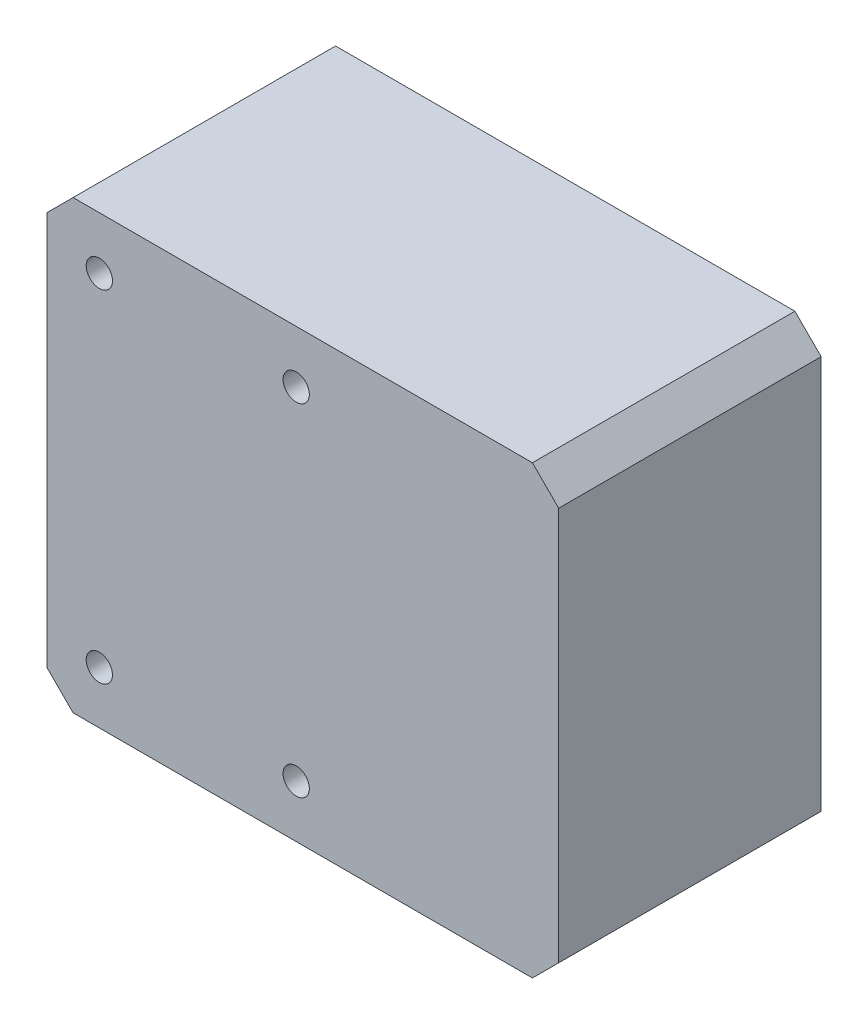
ISO-10303-21;
HEADER;
FILE_DESCRIPTION(('STEP AP214'),'2;1');
FILE_NAME('part.step','',(''),(''),'','','');
FILE_SCHEMA(('AUTOMOTIVE_DESIGN { 1 0 10303 214 1 1 1 1 }'));
ENDSEC;
DATA;
#1=APPLICATION_CONTEXT('core data for automotive mechanical design processes');
#2=APPLICATION_PROTOCOL_DEFINITION('international standard','automotive_design',2000,#1);
#3=PRODUCT_CONTEXT('',#1,'mechanical');
#4=PRODUCT('Part','Part','',(#3));
#5=PRODUCT_RELATED_PRODUCT_CATEGORY('part','',(#4));
#6=PRODUCT_DEFINITION_FORMATION('','',#4);
#7=PRODUCT_DEFINITION_CONTEXT('part definition',#1,'design');
#8=PRODUCT_DEFINITION('design','',#6,#7);
#9=PRODUCT_DEFINITION_SHAPE('','',#8);
#10=(LENGTH_UNIT() NAMED_UNIT(*) SI_UNIT(.MILLI.,.METRE.));
#11=(NAMED_UNIT(*) PLANE_ANGLE_UNIT() SI_UNIT($,.RADIAN.));
#12=(NAMED_UNIT(*) SI_UNIT($,.STERADIAN.) SOLID_ANGLE_UNIT());
#13=UNCERTAINTY_MEASURE_WITH_UNIT(LENGTH_MEASURE(1.E-05),#10,'distance_accuracy_value','');
#14=(GEOMETRIC_REPRESENTATION_CONTEXT(3) GLOBAL_UNCERTAINTY_ASSIGNED_CONTEXT((#13)) GLOBAL_UNIT_ASSIGNED_CONTEXT((#10,
#11,#12)) REPRESENTATION_CONTEXT('',''));
#15=CARTESIAN_POINT('',(0.,0.,0.));
#16=DIRECTION('',(0.,0.,1.));
#17=DIRECTION('',(1.,0.,0.));
#18=AXIS2_PLACEMENT_3D('',#15,#16,#17);
#19=CARTESIAN_POINT('',(0.,0.,100.));
#20=DIRECTION('',(0.,0.,-1.));
#21=DIRECTION('',(-1.,0.,0.));
#22=AXIS2_PLACEMENT_3D('',#19,#20,#21);
#23=PLANE('',#22);
#24=DIRECTION('',(-1.,0.,0.));
#25=VECTOR('',#24,1.);
#26=CARTESIAN_POINT('',(-57.5,85.,100.));
#27=LINE('',#26,#25);
#28=CARTESIAN_POINT('',(127.5,85.,100.));
#29=VERTEX_POINT('',#28);
#30=CARTESIAN_POINT('',(-47.5,85.,100.));
#31=VERTEX_POINT('',#30);
#32=EDGE_CURVE('E169',#29,#31,#27,.T.);
#33=ORIENTED_EDGE('',*,*,#32,.T.);
#34=DIRECTION('',(0.70710678118655,0.707106781186545,0.));
#35=VECTOR('',#34,1.);
#36=CARTESIAN_POINT('',(-57.5,75.0000000000001,100.));
#37=LINE('',#36,#35);
#38=CARTESIAN_POINT('',(-57.5,75.0000000000001,100.));
#39=VERTEX_POINT('',#38);
#40=EDGE_CURVE('E150',#31,#39,#37,.F.);
#41=ORIENTED_EDGE('',*,*,#40,.T.);
#42=DIRECTION('',(0.,-1.,0.));
#43=VECTOR('',#42,1.);
#44=CARTESIAN_POINT('',(-57.5,-85.,100.));
#45=LINE('',#44,#43);
#46=CARTESIAN_POINT('',(-57.5,-75.,100.));
#47=VERTEX_POINT('',#46);
#48=EDGE_CURVE('E120',#39,#47,#45,.T.);
#49=ORIENTED_EDGE('',*,*,#48,.T.);
#50=DIRECTION('',(-0.707106781186547,0.707106781186548,0.));
#51=VECTOR('',#50,1.);
#52=CARTESIAN_POINT('',(-47.5000000000001,-85.,100.));
#53=LINE('',#52,#51);
#54=CARTESIAN_POINT('',(-47.5000000000001,-85.,100.));
#55=VERTEX_POINT('',#54);
#56=EDGE_CURVE('E56',#47,#55,#53,.F.);
#57=ORIENTED_EDGE('',*,*,#56,.T.);
#58=DIRECTION('',(1.,0.,0.));
#59=VECTOR('',#58,1.);
#60=CARTESIAN_POINT('',(-57.5,-85.,100.));
#61=LINE('',#60,#59);
#62=CARTESIAN_POINT('',(127.5,-85.,100.));
#63=VERTEX_POINT('',#62);
#64=EDGE_CURVE('E136',#55,#63,#61,.T.);
#65=ORIENTED_EDGE('',*,*,#64,.T.);
#66=DIRECTION('',(-0.707106781186549,-0.707106781186547,0.));
#67=VECTOR('',#66,1.);
#68=CARTESIAN_POINT('',(137.5,-75.,100.));
#69=LINE('',#68,#67);
#70=CARTESIAN_POINT('',(137.5,-75.,100.));
#71=VERTEX_POINT('',#70);
#72=EDGE_CURVE('E147',#63,#71,#69,.F.);
#73=ORIENTED_EDGE('',*,*,#72,.T.);
#74=DIRECTION('',(0.,1.,0.));
#75=VECTOR('',#74,1.);
#76=CARTESIAN_POINT('',(137.5,-85.,100.));
#77=LINE('',#76,#75);
#78=CARTESIAN_POINT('',(137.5,75.,100.));
#79=VERTEX_POINT('',#78);
#80=EDGE_CURVE('E130',#71,#79,#77,.T.);
#81=ORIENTED_EDGE('',*,*,#80,.T.);
#82=DIRECTION('',(0.707106781186547,-0.707106781186548,0.));
#83=VECTOR('',#82,1.);
#84=CARTESIAN_POINT('',(127.5,85.,100.));
#85=LINE('',#84,#83);
#86=EDGE_CURVE('E145',#79,#29,#85,.F.);
#87=ORIENTED_EDGE('',*,*,#86,.T.);
#88=EDGE_LOOP('',(#33,#41,#49,#57,#65,#73,#81,#87));
#89=FACE_BOUND('',#88,.T.);
#90=CARTESIAN_POINT('',(-37.5,65.,100.));
#91=DIRECTION('',(0.,0.,1.));
#92=DIRECTION('',(1.,0.,0.));
#93=AXIS2_PLACEMENT_3D('',#90,#91,#92);
#94=CIRCLE('',#93,5.);
#95=CARTESIAN_POINT('',(-32.5,65.,100.));
#96=VERTEX_POINT('',#95);
#97=EDGE_CURVE('E174',#96,#96,#94,.T.);
#98=ORIENTED_EDGE('',*,*,#97,.F.);
#99=EDGE_LOOP('',(#98));
#100=FACE_BOUND('',#99,.T.);
#101=CARTESIAN_POINT('',(37.5,65.,100.));
#102=DIRECTION('',(0.,0.,1.));
#103=DIRECTION('',(1.,0.,0.));
#104=AXIS2_PLACEMENT_3D('',#101,#102,#103);
#105=CIRCLE('',#104,5.);
#106=CARTESIAN_POINT('',(42.5,65.,100.));
#107=VERTEX_POINT('',#106);
#108=EDGE_CURVE('E183',#107,#107,#105,.T.);
#109=ORIENTED_EDGE('',*,*,#108,.F.);
#110=EDGE_LOOP('',(#109));
#111=FACE_BOUND('',#110,.T.);
#112=CARTESIAN_POINT('',(-37.5,-65.,100.));
#113=DIRECTION('',(0.,0.,1.));
#114=DIRECTION('',(1.,0.,0.));
#115=AXIS2_PLACEMENT_3D('',#112,#113,#114);
#116=CIRCLE('',#115,5.);
#117=CARTESIAN_POINT('',(-32.5,-65.,100.));
#118=VERTEX_POINT('',#117);
#119=EDGE_CURVE('E188',#118,#118,#116,.T.);
#120=ORIENTED_EDGE('',*,*,#119,.F.);
#121=EDGE_LOOP('',(#120));
#122=FACE_BOUND('',#121,.T.);
#123=CARTESIAN_POINT('',(37.5,-65.,100.));
#124=DIRECTION('',(0.,0.,1.));
#125=DIRECTION('',(1.,0.,0.));
#126=AXIS2_PLACEMENT_3D('',#123,#124,#125);
#127=CIRCLE('',#126,5.);
#128=CARTESIAN_POINT('',(42.5,-65.,100.));
#129=VERTEX_POINT('',#128);
#130=EDGE_CURVE('E194',#129,#129,#127,.T.);
#131=ORIENTED_EDGE('',*,*,#130,.F.);
#132=EDGE_LOOP('',(#131));
#133=FACE_BOUND('',#132,.T.);
#134=ADVANCED_FACE('F34',(#89,#100,#111,#122,#133),#23,.F.);
#135=CARTESIAN_POINT('',(0.,0.,0.));
#136=DIRECTION('',(0.,0.,-1.));
#137=DIRECTION('',(-1.,0.,0.));
#138=AXIS2_PLACEMENT_3D('',#135,#136,#137);
#139=PLANE('',#138);
#140=CARTESIAN_POINT('',(-37.5,-65.,0.));
#141=DIRECTION('',(0.,0.,1.));
#142=DIRECTION('',(1.,0.,0.));
#143=AXIS2_PLACEMENT_3D('',#140,#141,#142);
#144=CIRCLE('',#143,5.);
#145=CARTESIAN_POINT('',(-32.5,-65.,0.));
#146=VERTEX_POINT('',#145);
#147=EDGE_CURVE('E191',#146,#146,#144,.T.);
#148=ORIENTED_EDGE('',*,*,#147,.T.);
#149=EDGE_LOOP('',(#148));
#150=FACE_BOUND('',#149,.T.);
#151=CARTESIAN_POINT('',(-37.5,65.,0.));
#152=DIRECTION('',(0.,0.,1.));
#153=DIRECTION('',(1.,0.,0.));
#154=AXIS2_PLACEMENT_3D('',#151,#152,#153);
#155=CIRCLE('',#154,5.);
#156=CARTESIAN_POINT('',(-32.5,65.,0.));
#157=VERTEX_POINT('',#156);
#158=EDGE_CURVE('E176',#157,#157,#155,.T.);
#159=ORIENTED_EDGE('',*,*,#158,.T.);
#160=EDGE_LOOP('',(#159));
#161=FACE_BOUND('',#160,.T.);
#162=DIRECTION('',(0.,-1.,0.));
#163=VECTOR('',#162,1.);
#164=CARTESIAN_POINT('',(-57.5,-85.,0.));
#165=LINE('',#164,#163);
#166=CARTESIAN_POINT('',(-57.5,75.0000000000001,0.));
#167=VERTEX_POINT('',#166);
#168=CARTESIAN_POINT('',(-57.5,-75.,0.));
#169=VERTEX_POINT('',#168);
#170=EDGE_CURVE('E118',#167,#169,#165,.T.);
#171=ORIENTED_EDGE('',*,*,#170,.F.);
#172=DIRECTION('',(-0.70710678118655,-0.707106781186545,0.));
#173=VECTOR('',#172,1.);
#174=CARTESIAN_POINT('',(-66.2499999999998,66.2500000000004,0.));
#175=LINE('',#174,#173);
#176=CARTESIAN_POINT('',(-47.5,85.,0.));
#177=VERTEX_POINT('',#176);
#178=EDGE_CURVE('E101',#167,#177,#175,.F.);
#179=ORIENTED_EDGE('',*,*,#178,.T.);
#180=DIRECTION('',(-1.,0.,0.));
#181=VECTOR('',#180,1.);
#182=CARTESIAN_POINT('',(-57.5,85.,0.));
#183=LINE('',#182,#181);
#184=CARTESIAN_POINT('',(127.5,85.,0.));
#185=VERTEX_POINT('',#184);
#186=EDGE_CURVE('E128',#185,#177,#183,.T.);
#187=ORIENTED_EDGE('',*,*,#186,.F.);
#188=DIRECTION('',(-0.707106781186547,0.707106781186548,0.));
#189=VECTOR('',#188,1.);
#190=CARTESIAN_POINT('',(106.25,106.25,0.));
#191=LINE('',#190,#189);
#192=CARTESIAN_POINT('',(137.5,75.,0.));
#193=VERTEX_POINT('',#192);
#194=EDGE_CURVE('E121',#185,#193,#191,.F.);
#195=ORIENTED_EDGE('',*,*,#194,.T.);
#196=DIRECTION('',(0.,1.,0.));
#197=VECTOR('',#196,1.);
#198=CARTESIAN_POINT('',(137.5,-85.,0.));
#199=LINE('',#198,#197);
#200=CARTESIAN_POINT('',(137.5,-75.,0.));
#201=VERTEX_POINT('',#200);
#202=EDGE_CURVE('E132',#201,#193,#199,.T.);
#203=ORIENTED_EDGE('',*,*,#202,.F.);
#204=DIRECTION('',(0.707106781186549,0.707106781186547,0.));
#205=VECTOR('',#204,1.);
#206=CARTESIAN_POINT('',(106.25,-106.25,0.));
#207=LINE('',#206,#205);
#208=CARTESIAN_POINT('',(127.5,-85.,0.));
#209=VERTEX_POINT('',#208);
#210=EDGE_CURVE('E139',#201,#209,#207,.F.);
#211=ORIENTED_EDGE('',*,*,#210,.T.);
#212=DIRECTION('',(1.,0.,0.));
#213=VECTOR('',#212,1.);
#214=CARTESIAN_POINT('',(-57.5,-85.,0.));
#215=LINE('',#214,#213);
#216=CARTESIAN_POINT('',(-47.5000000000001,-85.,0.));
#217=VERTEX_POINT('',#216);
#218=EDGE_CURVE('E127',#217,#209,#215,.T.);
#219=ORIENTED_EDGE('',*,*,#218,.F.);
#220=DIRECTION('',(0.707106781186547,-0.707106781186548,0.));
#221=VECTOR('',#220,1.);
#222=CARTESIAN_POINT('',(-66.2500000000001,-66.2499999999999,0.));
#223=LINE('',#222,#221);
#224=EDGE_CURVE('E112',#217,#169,#223,.F.);
#225=ORIENTED_EDGE('',*,*,#224,.T.);
#226=EDGE_LOOP('',(#171,#179,#187,#195,#203,#211,#219,#225));
#227=FACE_BOUND('',#226,.T.);
#228=CARTESIAN_POINT('',(37.5,65.,0.));
#229=DIRECTION('',(0.,0.,1.));
#230=DIRECTION('',(1.,0.,0.));
#231=AXIS2_PLACEMENT_3D('',#228,#229,#230);
#232=CIRCLE('',#231,5.);
#233=CARTESIAN_POINT('',(42.5,65.,0.));
#234=VERTEX_POINT('',#233);
#235=EDGE_CURVE('E185',#234,#234,#232,.T.);
#236=ORIENTED_EDGE('',*,*,#235,.T.);
#237=EDGE_LOOP('',(#236));
#238=FACE_BOUND('',#237,.T.);
#239=CARTESIAN_POINT('',(37.5,-65.,0.));
#240=DIRECTION('',(0.,0.,1.));
#241=DIRECTION('',(1.,0.,0.));
#242=AXIS2_PLACEMENT_3D('',#239,#240,#241);
#243=CIRCLE('',#242,5.);
#244=CARTESIAN_POINT('',(42.5,-65.,0.));
#245=VERTEX_POINT('',#244);
#246=EDGE_CURVE('E197',#245,#245,#243,.T.);
#247=ORIENTED_EDGE('',*,*,#246,.T.);
#248=EDGE_LOOP('',(#247));
#249=FACE_BOUND('',#248,.T.);
#250=ADVANCED_FACE('F124',(#150,#161,#227,#238,#249),#139,.T.);
#251=CARTESIAN_POINT('',(137.5,-85.,100.));
#252=DIRECTION('',(-1.,0.,0.));
#253=DIRECTION('',(0.,0.,1.));
#254=AXIS2_PLACEMENT_3D('',#251,#252,#253);
#255=PLANE('',#254);
#256=ORIENTED_EDGE('',*,*,#80,.F.);
#257=DIRECTION('',(0.,0.,-1.));
#258=VECTOR('',#257,1.);
#259=CARTESIAN_POINT('',(137.5,-75.,100.));
#260=LINE('',#259,#258);
#261=EDGE_CURVE('E11',#71,#201,#260,.T.);
#262=ORIENTED_EDGE('',*,*,#261,.T.);
#263=ORIENTED_EDGE('',*,*,#202,.T.);
#264=DIRECTION('',(0.,0.,1.));
#265=VECTOR('',#264,1.);
#266=CARTESIAN_POINT('',(137.5,75.,100.));
#267=LINE('',#266,#265);
#268=EDGE_CURVE('E42',#193,#79,#267,.T.);
#269=ORIENTED_EDGE('',*,*,#268,.T.);
#270=EDGE_LOOP('',(#256,#262,#263,#269));
#271=FACE_BOUND('',#270,.T.);
#272=ADVANCED_FACE('F160',(#271),#255,.F.);
#273=CARTESIAN_POINT('',(-57.5,85.,100.));
#274=DIRECTION('',(0.,-1.,0.));
#275=DIRECTION('',(1.,0.,0.));
#276=AXIS2_PLACEMENT_3D('',#273,#274,#275);
#277=PLANE('',#276);
#278=ORIENTED_EDGE('',*,*,#186,.T.);
#279=DIRECTION('',(0.,0.,1.));
#280=VECTOR('',#279,1.);
#281=CARTESIAN_POINT('',(-47.5,85.,100.));
#282=LINE('',#281,#280);
#283=EDGE_CURVE('E106',#177,#31,#282,.T.);
#284=ORIENTED_EDGE('',*,*,#283,.T.);
#285=ORIENTED_EDGE('',*,*,#32,.F.);
#286=DIRECTION('',(0.,0.,-1.));
#287=VECTOR('',#286,1.);
#288=CARTESIAN_POINT('',(127.5,85.,100.));
#289=LINE('',#288,#287);
#290=EDGE_CURVE('E111',#29,#185,#289,.T.);
#291=ORIENTED_EDGE('',*,*,#290,.T.);
#292=EDGE_LOOP('',(#278,#284,#285,#291));
#293=FACE_BOUND('',#292,.T.);
#294=ADVANCED_FACE('F173',(#293),#277,.F.);
#295=CARTESIAN_POINT('',(-57.5,-85.,100.));
#296=DIRECTION('',(1.,0.,0.));
#297=DIRECTION('',(0.,0.,-1.));
#298=AXIS2_PLACEMENT_3D('',#295,#296,#297);
#299=PLANE('',#298);
#300=ORIENTED_EDGE('',*,*,#48,.F.);
#301=DIRECTION('',(0.,0.,-1.));
#302=VECTOR('',#301,1.);
#303=CARTESIAN_POINT('',(-57.5,75.0000000000001,100.));
#304=LINE('',#303,#302);
#305=EDGE_CURVE('E105',#39,#167,#304,.T.);
#306=ORIENTED_EDGE('',*,*,#305,.T.);
#307=ORIENTED_EDGE('',*,*,#170,.T.);
#308=DIRECTION('',(0.,0.,1.));
#309=VECTOR('',#308,1.);
#310=CARTESIAN_POINT('',(-57.5,-75.,100.));
#311=LINE('',#310,#309);
#312=EDGE_CURVE('E122',#169,#47,#311,.T.);
#313=ORIENTED_EDGE('',*,*,#312,.T.);
#314=EDGE_LOOP('',(#300,#306,#307,#313));
#315=FACE_BOUND('',#314,.T.);
#316=ADVANCED_FACE('F117',(#315),#299,.F.);
#317=CARTESIAN_POINT('',(-57.5,-85.,100.));
#318=DIRECTION('',(0.,1.,0.));
#319=DIRECTION('',(0.,0.,1.));
#320=AXIS2_PLACEMENT_3D('',#317,#318,#319);
#321=PLANE('',#320);
#322=ORIENTED_EDGE('',*,*,#64,.F.);
#323=DIRECTION('',(0.,0.,-1.));
#324=VECTOR('',#323,1.);
#325=CARTESIAN_POINT('',(-47.5000000000001,-85.,100.));
#326=LINE('',#325,#324);
#327=EDGE_CURVE('E153',#55,#217,#326,.T.);
#328=ORIENTED_EDGE('',*,*,#327,.T.);
#329=ORIENTED_EDGE('',*,*,#218,.T.);
#330=DIRECTION('',(0.,0.,1.));
#331=VECTOR('',#330,1.);
#332=CARTESIAN_POINT('',(127.5,-85.,100.));
#333=LINE('',#332,#331);
#334=EDGE_CURVE('E49',#209,#63,#333,.T.);
#335=ORIENTED_EDGE('',*,*,#334,.T.);
#336=EDGE_LOOP('',(#322,#328,#329,#335));
#337=FACE_BOUND('',#336,.T.);
#338=ADVANCED_FACE('F217',(#337),#321,.F.);
#339=CARTESIAN_POINT('',(-37.5,65.,100.));
#340=DIRECTION('',(0.,0.,-1.));
#341=DIRECTION('',(-1.,0.,0.));
#342=AXIS2_PLACEMENT_3D('',#339,#340,#341);
#343=CYLINDRICAL_SURFACE('',#342,5.);
#344=ORIENTED_EDGE('',*,*,#97,.T.);
#345=EDGE_LOOP('',(#344));
#346=FACE_BOUND('',#345,.T.);
#347=ORIENTED_EDGE('',*,*,#158,.F.);
#348=EDGE_LOOP('',(#347));
#349=FACE_BOUND('',#348,.T.);
#350=ADVANCED_FACE('F214',(#346,#349),#343,.F.);
#351=CARTESIAN_POINT('',(37.5,65.,100.));
#352=DIRECTION('',(0.,0.,-1.));
#353=DIRECTION('',(-1.,0.,0.));
#354=AXIS2_PLACEMENT_3D('',#351,#352,#353);
#355=CYLINDRICAL_SURFACE('',#354,5.);
#356=ORIENTED_EDGE('',*,*,#108,.T.);
#357=EDGE_LOOP('',(#356));
#358=FACE_BOUND('',#357,.T.);
#359=ORIENTED_EDGE('',*,*,#235,.F.);
#360=EDGE_LOOP('',(#359));
#361=FACE_BOUND('',#360,.T.);
#362=ADVANCED_FACE('F309',(#358,#361),#355,.F.);
#363=CARTESIAN_POINT('',(-37.5,-65.,100.));
#364=DIRECTION('',(0.,0.,-1.));
#365=DIRECTION('',(-1.,0.,0.));
#366=AXIS2_PLACEMENT_3D('',#363,#364,#365);
#367=CYLINDRICAL_SURFACE('',#366,5.);
#368=ORIENTED_EDGE('',*,*,#119,.T.);
#369=EDGE_LOOP('',(#368));
#370=FACE_BOUND('',#369,.T.);
#371=ORIENTED_EDGE('',*,*,#147,.F.);
#372=EDGE_LOOP('',(#371));
#373=FACE_BOUND('',#372,.T.);
#374=ADVANCED_FACE('F300',(#370,#373),#367,.F.);
#375=CARTESIAN_POINT('',(37.5,-65.,100.));
#376=DIRECTION('',(0.,0.,-1.));
#377=DIRECTION('',(-1.,0.,0.));
#378=AXIS2_PLACEMENT_3D('',#375,#376,#377);
#379=CYLINDRICAL_SURFACE('',#378,5.);
#380=ORIENTED_EDGE('',*,*,#130,.T.);
#381=EDGE_LOOP('',(#380));
#382=FACE_BOUND('',#381,.T.);
#383=ORIENTED_EDGE('',*,*,#246,.F.);
#384=EDGE_LOOP('',(#383));
#385=FACE_BOUND('',#384,.T.);
#386=ADVANCED_FACE('F203',(#382,#385),#379,.F.);
#387=CARTESIAN_POINT('',(-57.5,75.0000000000001,100.));
#388=DIRECTION('',(0.707106781186545,-0.70710678118655,0.));
#389=DIRECTION('',(0.,0.,-1.));
#390=AXIS2_PLACEMENT_3D('',#387,#388,#389);
#391=PLANE('',#390);
#392=ORIENTED_EDGE('',*,*,#40,.F.);
#393=ORIENTED_EDGE('',*,*,#283,.F.);
#394=ORIENTED_EDGE('',*,*,#178,.F.);
#395=ORIENTED_EDGE('',*,*,#305,.F.);
#396=EDGE_LOOP('',(#392,#393,#394,#395));
#397=FACE_BOUND('',#396,.T.);
#398=ADVANCED_FACE('F104',(#397),#391,.F.);
#399=CARTESIAN_POINT('',(-47.5000000000001,-85.,100.));
#400=DIRECTION('',(0.707106781186548,0.707106781186547,0.));
#401=DIRECTION('',(0.,0.,-1.));
#402=AXIS2_PLACEMENT_3D('',#399,#400,#401);
#403=PLANE('',#402);
#404=ORIENTED_EDGE('',*,*,#56,.F.);
#405=ORIENTED_EDGE('',*,*,#312,.F.);
#406=ORIENTED_EDGE('',*,*,#224,.F.);
#407=ORIENTED_EDGE('',*,*,#327,.F.);
#408=EDGE_LOOP('',(#404,#405,#406,#407));
#409=FACE_BOUND('',#408,.T.);
#410=ADVANCED_FACE('F228',(#409),#403,.F.);
#411=CARTESIAN_POINT('',(137.5,-75.,100.));
#412=DIRECTION('',(-0.707106781186546,0.707106781186548,0.));
#413=DIRECTION('',(0.,0.,-1.));
#414=AXIS2_PLACEMENT_3D('',#411,#412,#413);
#415=PLANE('',#414);
#416=ORIENTED_EDGE('',*,*,#72,.F.);
#417=ORIENTED_EDGE('',*,*,#334,.F.);
#418=ORIENTED_EDGE('',*,*,#210,.F.);
#419=ORIENTED_EDGE('',*,*,#261,.F.);
#420=EDGE_LOOP('',(#416,#417,#418,#419));
#421=FACE_BOUND('',#420,.T.);
#422=ADVANCED_FACE('F230',(#421),#415,.F.);
#423=CARTESIAN_POINT('',(127.5,85.,100.));
#424=DIRECTION('',(-0.707106781186548,-0.707106781186547,0.));
#425=DIRECTION('',(0.,0.,-1.));
#426=AXIS2_PLACEMENT_3D('',#423,#424,#425);
#427=PLANE('',#426);
#428=ORIENTED_EDGE('',*,*,#86,.F.);
#429=ORIENTED_EDGE('',*,*,#268,.F.);
#430=ORIENTED_EDGE('',*,*,#194,.F.);
#431=ORIENTED_EDGE('',*,*,#290,.F.);
#432=EDGE_LOOP('',(#428,#429,#430,#431));
#433=FACE_BOUND('',#432,.T.);
#434=ADVANCED_FACE('F36',(#433),#427,.F.);
#435=CLOSED_SHELL('',(#134,#250,#272,#294,#316,#338,#350,#362,#374,#386,#398,#410,#422,#434));
#436=MANIFOLD_SOLID_BREP('B2',#435);
#437=ADVANCED_BREP_SHAPE_REPRESENTATION('',(#18,#436),#14);
#438=SHAPE_DEFINITION_REPRESENTATION(#9,#437);
ENDSEC;
END-ISO-10303-21;
